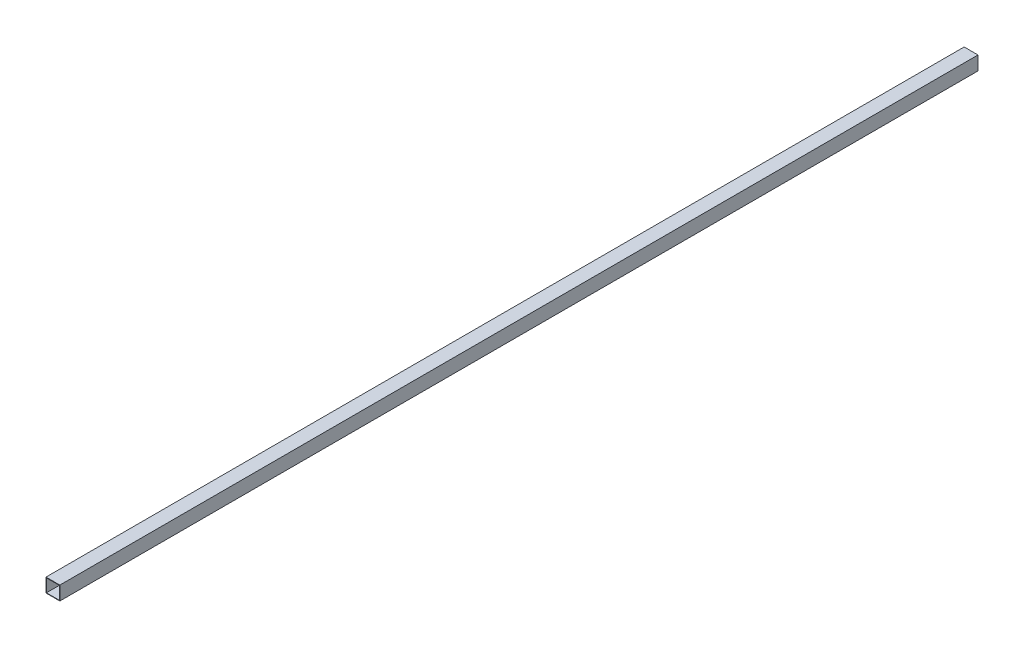
ISO-10303-21;
HEADER;
FILE_DESCRIPTION(('STEP AP214'),'2;1');
FILE_NAME('part.step','',(''),(''),'','','');
FILE_SCHEMA(('AUTOMOTIVE_DESIGN { 1 0 10303 214 1 1 1 1 }'));
ENDSEC;
DATA;
#1=APPLICATION_CONTEXT('core data for automotive mechanical design processes');
#2=APPLICATION_PROTOCOL_DEFINITION('international standard','automotive_design',2000,#1);
#3=PRODUCT_CONTEXT('',#1,'mechanical');
#4=PRODUCT('Part','Part','',(#3));
#5=PRODUCT_RELATED_PRODUCT_CATEGORY('part','',(#4));
#6=PRODUCT_DEFINITION_FORMATION('','',#4);
#7=PRODUCT_DEFINITION_CONTEXT('part definition',#1,'design');
#8=PRODUCT_DEFINITION('design','',#6,#7);
#9=PRODUCT_DEFINITION_SHAPE('','',#8);
#10=(LENGTH_UNIT() NAMED_UNIT(*) SI_UNIT(.MILLI.,.METRE.));
#11=(NAMED_UNIT(*) PLANE_ANGLE_UNIT() SI_UNIT($,.RADIAN.));
#12=(NAMED_UNIT(*) SI_UNIT($,.STERADIAN.) SOLID_ANGLE_UNIT());
#13=UNCERTAINTY_MEASURE_WITH_UNIT(LENGTH_MEASURE(1.E-05),#10,'distance_accuracy_value','');
#14=(GEOMETRIC_REPRESENTATION_CONTEXT(3) GLOBAL_UNCERTAINTY_ASSIGNED_CONTEXT((#13)) GLOBAL_UNIT_ASSIGNED_CONTEXT((#10,
#11,#12)) REPRESENTATION_CONTEXT('',''));
#15=CARTESIAN_POINT('',(0.,0.,0.));
#16=DIRECTION('',(0.,0.,1.));
#17=DIRECTION('',(1.,0.,0.));
#18=AXIS2_PLACEMENT_3D('',#15,#16,#17);
#19=CARTESIAN_POINT('',(-15.,-15.,995.));
#20=DIRECTION('',(0.,0.,1.));
#21=DIRECTION('',(1.,0.,0.));
#22=AXIS2_PLACEMENT_3D('',#19,#20,#21);
#23=PLANE('',#22);
#24=DIRECTION('',(0.,-1.,0.));
#25=VECTOR('',#24,1.);
#26=CARTESIAN_POINT('',(-15.,-15.,995.));
#27=LINE('',#26,#25);
#28=CARTESIAN_POINT('',(-15.,15.,995.));
#29=VERTEX_POINT('',#28);
#30=CARTESIAN_POINT('',(-15.,-15.,995.));
#31=VERTEX_POINT('',#30);
#32=EDGE_CURVE('E155',#29,#31,#27,.T.);
#33=ORIENTED_EDGE('',*,*,#32,.T.);
#34=DIRECTION('',(1.,0.,0.));
#35=VECTOR('',#34,1.);
#36=CARTESIAN_POINT('',(15.,-15.,995.));
#37=LINE('',#36,#35);
#38=CARTESIAN_POINT('',(15.,-15.,995.));
#39=VERTEX_POINT('',#38);
#40=EDGE_CURVE('E158',#31,#39,#37,.T.);
#41=ORIENTED_EDGE('',*,*,#40,.T.);
#42=DIRECTION('',(0.,1.,0.));
#43=VECTOR('',#42,1.);
#44=CARTESIAN_POINT('',(15.,-15.,995.));
#45=LINE('',#44,#43);
#46=CARTESIAN_POINT('',(15.,15.,995.));
#47=VERTEX_POINT('',#46);
#48=EDGE_CURVE('E161',#39,#47,#45,.T.);
#49=ORIENTED_EDGE('',*,*,#48,.T.);
#50=DIRECTION('',(-1.,0.,0.));
#51=VECTOR('',#50,1.);
#52=CARTESIAN_POINT('',(15.,15.,995.));
#53=LINE('',#52,#51);
#54=EDGE_CURVE('E163',#47,#29,#53,.T.);
#55=ORIENTED_EDGE('',*,*,#54,.T.);
#56=EDGE_LOOP('',(#33,#41,#49,#55));
#57=FACE_BOUND('',#56,.T.);
#58=DIRECTION('',(1.,0.,0.));
#59=VECTOR('',#58,1.);
#60=CARTESIAN_POINT('',(15.,-14.,995.));
#61=LINE('',#60,#59);
#62=CARTESIAN_POINT('',(-14.,-14.,995.));
#63=VERTEX_POINT('',#62);
#64=CARTESIAN_POINT('',(14.,-14.,995.));
#65=VERTEX_POINT('',#64);
#66=EDGE_CURVE('E127',#63,#65,#61,.T.);
#67=ORIENTED_EDGE('',*,*,#66,.F.);
#68=DIRECTION('',(0.,-1.,0.));
#69=VECTOR('',#68,1.);
#70=CARTESIAN_POINT('',(-14.,-15.,995.));
#71=LINE('',#70,#69);
#72=CARTESIAN_POINT('',(-14.,14.,995.));
#73=VERTEX_POINT('',#72);
#74=EDGE_CURVE('E119',#73,#63,#71,.T.);
#75=ORIENTED_EDGE('',*,*,#74,.F.);
#76=DIRECTION('',(-1.,0.,0.));
#77=VECTOR('',#76,1.);
#78=CARTESIAN_POINT('',(15.,14.,995.));
#79=LINE('',#78,#77);
#80=CARTESIAN_POINT('',(14.,14.,995.));
#81=VERTEX_POINT('',#80);
#82=EDGE_CURVE('E141',#81,#73,#79,.T.);
#83=ORIENTED_EDGE('',*,*,#82,.F.);
#84=DIRECTION('',(0.,1.,0.));
#85=VECTOR('',#84,1.);
#86=CARTESIAN_POINT('',(14.,-15.,995.));
#87=LINE('',#86,#85);
#88=EDGE_CURVE('E139',#65,#81,#87,.T.);
#89=ORIENTED_EDGE('',*,*,#88,.F.);
#90=EDGE_LOOP('',(#67,#75,#83,#89));
#91=FACE_BOUND('',#90,.T.);
#92=ADVANCED_FACE('F54',(#57,#91),#23,.T.);
#93=CARTESIAN_POINT('',(-15.,-15.,-995.));
#94=DIRECTION('',(0.,0.,1.));
#95=DIRECTION('',(1.,0.,0.));
#96=AXIS2_PLACEMENT_3D('',#93,#94,#95);
#97=PLANE('',#96);
#98=DIRECTION('',(0.,-1.,0.));
#99=VECTOR('',#98,1.);
#100=CARTESIAN_POINT('',(-15.,-15.,-995.));
#101=LINE('',#100,#99);
#102=CARTESIAN_POINT('',(-15.,15.,-995.));
#103=VERTEX_POINT('',#102);
#104=CARTESIAN_POINT('',(-15.,-15.,-995.));
#105=VERTEX_POINT('',#104);
#106=EDGE_CURVE('E135',#103,#105,#101,.T.);
#107=ORIENTED_EDGE('',*,*,#106,.F.);
#108=DIRECTION('',(-1.,0.,0.));
#109=VECTOR('',#108,1.);
#110=CARTESIAN_POINT('',(15.,15.,-995.));
#111=LINE('',#110,#109);
#112=CARTESIAN_POINT('',(15.,15.,-995.));
#113=VERTEX_POINT('',#112);
#114=EDGE_CURVE('E159',#113,#103,#111,.T.);
#115=ORIENTED_EDGE('',*,*,#114,.F.);
#116=DIRECTION('',(0.,1.,0.));
#117=VECTOR('',#116,1.);
#118=CARTESIAN_POINT('',(15.,-15.,-995.));
#119=LINE('',#118,#117);
#120=CARTESIAN_POINT('',(15.,-15.,-995.));
#121=VERTEX_POINT('',#120);
#122=EDGE_CURVE('E170',#121,#113,#119,.T.);
#123=ORIENTED_EDGE('',*,*,#122,.F.);
#124=DIRECTION('',(1.,0.,0.));
#125=VECTOR('',#124,1.);
#126=CARTESIAN_POINT('',(15.,-15.,-995.));
#127=LINE('',#126,#125);
#128=EDGE_CURVE('E168',#105,#121,#127,.T.);
#129=ORIENTED_EDGE('',*,*,#128,.F.);
#130=EDGE_LOOP('',(#107,#115,#123,#129));
#131=FACE_BOUND('',#130,.T.);
#132=DIRECTION('',(0.,-1.,0.));
#133=VECTOR('',#132,1.);
#134=CARTESIAN_POINT('',(-14.,-15.,-995.));
#135=LINE('',#134,#133);
#136=CARTESIAN_POINT('',(-14.,14.,-995.));
#137=VERTEX_POINT('',#136);
#138=CARTESIAN_POINT('',(-14.,-14.,-995.));
#139=VERTEX_POINT('',#138);
#140=EDGE_CURVE('E77',#137,#139,#135,.T.);
#141=ORIENTED_EDGE('',*,*,#140,.T.);
#142=DIRECTION('',(1.,0.,0.));
#143=VECTOR('',#142,1.);
#144=CARTESIAN_POINT('',(15.,-14.,-995.));
#145=LINE('',#144,#143);
#146=CARTESIAN_POINT('',(14.,-14.,-995.));
#147=VERTEX_POINT('',#146);
#148=EDGE_CURVE('E134',#139,#147,#145,.T.);
#149=ORIENTED_EDGE('',*,*,#148,.T.);
#150=DIRECTION('',(0.,1.,0.));
#151=VECTOR('',#150,1.);
#152=CARTESIAN_POINT('',(14.,-15.,-995.));
#153=LINE('',#152,#151);
#154=CARTESIAN_POINT('',(14.,14.,-995.));
#155=VERTEX_POINT('',#154);
#156=EDGE_CURVE('E147',#147,#155,#153,.T.);
#157=ORIENTED_EDGE('',*,*,#156,.T.);
#158=DIRECTION('',(-1.,0.,0.));
#159=VECTOR('',#158,1.);
#160=CARTESIAN_POINT('',(15.,14.,-995.));
#161=LINE('',#160,#159);
#162=EDGE_CURVE('E128',#155,#137,#161,.T.);
#163=ORIENTED_EDGE('',*,*,#162,.T.);
#164=EDGE_LOOP('',(#141,#149,#157,#163));
#165=FACE_BOUND('',#164,.T.);
#166=ADVANCED_FACE('F188',(#131,#165),#97,.F.);
#167=CARTESIAN_POINT('',(-15.,-15.,995.));
#168=DIRECTION('',(1.,0.,0.));
#169=DIRECTION('',(0.,0.,-1.));
#170=AXIS2_PLACEMENT_3D('',#167,#168,#169);
#171=PLANE('',#170);
#172=ORIENTED_EDGE('',*,*,#106,.T.);
#173=DIRECTION('',(0.,0.,-1.));
#174=VECTOR('',#173,1.);
#175=CARTESIAN_POINT('',(-15.,-15.,995.));
#176=LINE('',#175,#174);
#177=EDGE_CURVE('E12',#31,#105,#176,.T.);
#178=ORIENTED_EDGE('',*,*,#177,.F.);
#179=ORIENTED_EDGE('',*,*,#32,.F.);
#180=DIRECTION('',(0.,0.,-1.));
#181=VECTOR('',#180,1.);
#182=CARTESIAN_POINT('',(-15.,15.,995.));
#183=LINE('',#182,#181);
#184=EDGE_CURVE('E165',#29,#103,#183,.T.);
#185=ORIENTED_EDGE('',*,*,#184,.T.);
#186=EDGE_LOOP('',(#172,#178,#179,#185));
#187=FACE_BOUND('',#186,.T.);
#188=ADVANCED_FACE('F56',(#187),#171,.F.);
#189=CARTESIAN_POINT('',(15.,-15.,995.));
#190=DIRECTION('',(0.,1.,0.));
#191=DIRECTION('',(-1.,0.,0.));
#192=AXIS2_PLACEMENT_3D('',#189,#190,#191);
#193=PLANE('',#192);
#194=ORIENTED_EDGE('',*,*,#128,.T.);
#195=DIRECTION('',(0.,0.,-1.));
#196=VECTOR('',#195,1.);
#197=CARTESIAN_POINT('',(15.,-15.,995.));
#198=LINE('',#197,#196);
#199=EDGE_CURVE('E62',#39,#121,#198,.T.);
#200=ORIENTED_EDGE('',*,*,#199,.F.);
#201=ORIENTED_EDGE('',*,*,#40,.F.);
#202=ORIENTED_EDGE('',*,*,#177,.T.);
#203=EDGE_LOOP('',(#194,#200,#201,#202));
#204=FACE_BOUND('',#203,.T.);
#205=ADVANCED_FACE('F198',(#204),#193,.F.);
#206=CARTESIAN_POINT('',(15.,-15.,995.));
#207=DIRECTION('',(-1.,0.,0.));
#208=DIRECTION('',(0.,0.,1.));
#209=AXIS2_PLACEMENT_3D('',#206,#207,#208);
#210=PLANE('',#209);
#211=ORIENTED_EDGE('',*,*,#122,.T.);
#212=DIRECTION('',(0.,0.,-1.));
#213=VECTOR('',#212,1.);
#214=CARTESIAN_POINT('',(15.,15.,995.));
#215=LINE('',#214,#213);
#216=EDGE_CURVE('E175',#47,#113,#215,.T.);
#217=ORIENTED_EDGE('',*,*,#216,.F.);
#218=ORIENTED_EDGE('',*,*,#48,.F.);
#219=ORIENTED_EDGE('',*,*,#199,.T.);
#220=EDGE_LOOP('',(#211,#217,#218,#219));
#221=FACE_BOUND('',#220,.T.);
#222=ADVANCED_FACE('F182',(#221),#210,.F.);
#223=CARTESIAN_POINT('',(15.,15.,995.));
#224=DIRECTION('',(0.,-1.,0.));
#225=DIRECTION('',(1.,0.,0.));
#226=AXIS2_PLACEMENT_3D('',#223,#224,#225);
#227=PLANE('',#226);
#228=ORIENTED_EDGE('',*,*,#114,.T.);
#229=ORIENTED_EDGE('',*,*,#184,.F.);
#230=ORIENTED_EDGE('',*,*,#54,.F.);
#231=ORIENTED_EDGE('',*,*,#216,.T.);
#232=EDGE_LOOP('',(#228,#229,#230,#231));
#233=FACE_BOUND('',#232,.T.);
#234=ADVANCED_FACE('F192',(#233),#227,.F.);
#235=CARTESIAN_POINT('',(-14.,-15.,995.));
#236=DIRECTION('',(1.,0.,0.));
#237=DIRECTION('',(0.,0.,-1.));
#238=AXIS2_PLACEMENT_3D('',#235,#236,#237);
#239=PLANE('',#238);
#240=ORIENTED_EDGE('',*,*,#140,.F.);
#241=DIRECTION('',(0.,0.,-1.));
#242=VECTOR('',#241,1.);
#243=CARTESIAN_POINT('',(-14.,14.,995.));
#244=LINE('',#243,#242);
#245=EDGE_CURVE('E123',#73,#137,#244,.T.);
#246=ORIENTED_EDGE('',*,*,#245,.F.);
#247=ORIENTED_EDGE('',*,*,#74,.T.);
#248=DIRECTION('',(0.,0.,-1.));
#249=VECTOR('',#248,1.);
#250=CARTESIAN_POINT('',(-14.,-14.,995.));
#251=LINE('',#250,#249);
#252=EDGE_CURVE('E122',#63,#139,#251,.T.);
#253=ORIENTED_EDGE('',*,*,#252,.T.);
#254=EDGE_LOOP('',(#240,#246,#247,#253));
#255=FACE_BOUND('',#254,.T.);
#256=ADVANCED_FACE('F121',(#255),#239,.T.);
#257=CARTESIAN_POINT('',(15.,-14.,995.));
#258=DIRECTION('',(0.,1.,0.));
#259=DIRECTION('',(-1.,0.,0.));
#260=AXIS2_PLACEMENT_3D('',#257,#258,#259);
#261=PLANE('',#260);
#262=ORIENTED_EDGE('',*,*,#148,.F.);
#263=ORIENTED_EDGE('',*,*,#252,.F.);
#264=ORIENTED_EDGE('',*,*,#66,.T.);
#265=DIRECTION('',(0.,0.,-1.));
#266=VECTOR('',#265,1.);
#267=CARTESIAN_POINT('',(14.,-14.,995.));
#268=LINE('',#267,#266);
#269=EDGE_CURVE('E136',#65,#147,#268,.T.);
#270=ORIENTED_EDGE('',*,*,#269,.T.);
#271=EDGE_LOOP('',(#262,#263,#264,#270));
#272=FACE_BOUND('',#271,.T.);
#273=ADVANCED_FACE('F131',(#272),#261,.T.);
#274=CARTESIAN_POINT('',(14.,-15.,995.));
#275=DIRECTION('',(-1.,0.,0.));
#276=DIRECTION('',(0.,0.,1.));
#277=AXIS2_PLACEMENT_3D('',#274,#275,#276);
#278=PLANE('',#277);
#279=ORIENTED_EDGE('',*,*,#156,.F.);
#280=ORIENTED_EDGE('',*,*,#269,.F.);
#281=ORIENTED_EDGE('',*,*,#88,.T.);
#282=DIRECTION('',(0.,0.,-1.));
#283=VECTOR('',#282,1.);
#284=CARTESIAN_POINT('',(14.,14.,995.));
#285=LINE('',#284,#283);
#286=EDGE_CURVE('E69',#81,#155,#285,.T.);
#287=ORIENTED_EDGE('',*,*,#286,.T.);
#288=EDGE_LOOP('',(#279,#280,#281,#287));
#289=FACE_BOUND('',#288,.T.);
#290=ADVANCED_FACE('F221',(#289),#278,.T.);
#291=CARTESIAN_POINT('',(15.,14.,995.));
#292=DIRECTION('',(0.,-1.,0.));
#293=DIRECTION('',(1.,0.,0.));
#294=AXIS2_PLACEMENT_3D('',#291,#292,#293);
#295=PLANE('',#294);
#296=ORIENTED_EDGE('',*,*,#162,.F.);
#297=ORIENTED_EDGE('',*,*,#286,.F.);
#298=ORIENTED_EDGE('',*,*,#82,.T.);
#299=ORIENTED_EDGE('',*,*,#245,.T.);
#300=EDGE_LOOP('',(#296,#297,#298,#299));
#301=FACE_BOUND('',#300,.T.);
#302=ADVANCED_FACE('F225',(#301),#295,.T.);
#303=CLOSED_SHELL('',(#92,#166,#188,#205,#222,#234,#256,#273,#290,#302));
#304=MANIFOLD_SOLID_BREP('B2',#303);
#305=ADVANCED_BREP_SHAPE_REPRESENTATION('',(#18,#304),#14);
#306=SHAPE_DEFINITION_REPRESENTATION(#9,#305);
ENDSEC;
END-ISO-10303-21;
